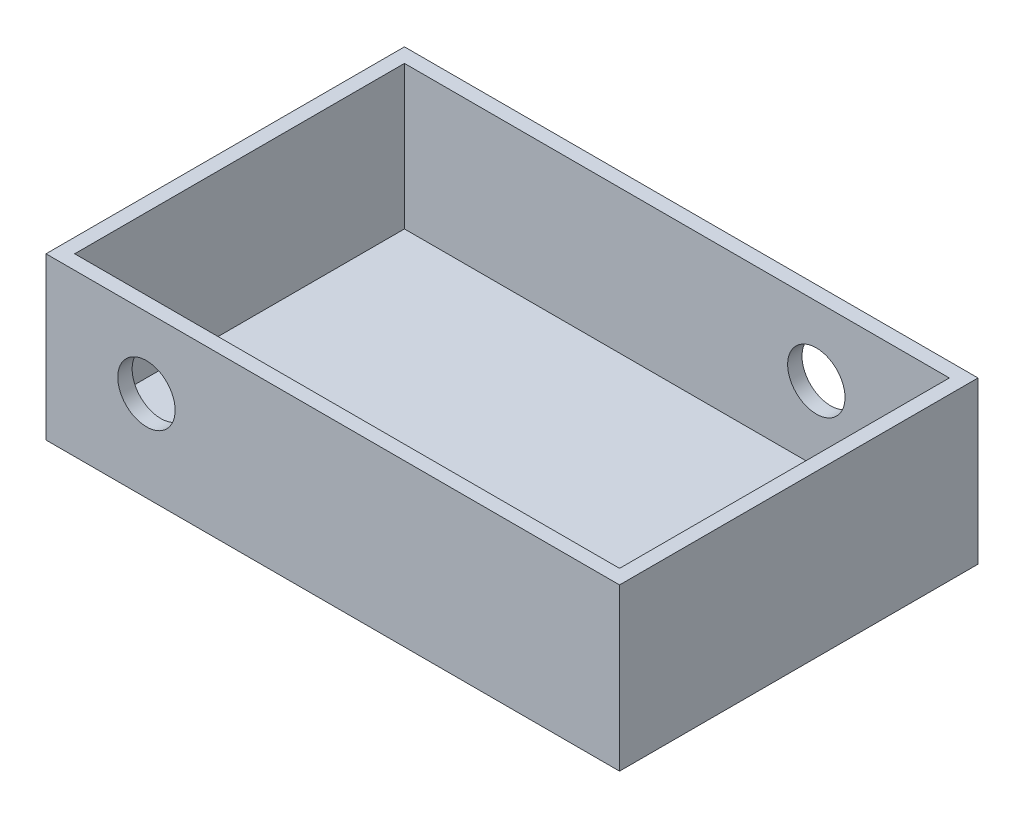
ISO-10303-21;
HEADER;
FILE_DESCRIPTION(('STEP AP214'),'2;1');
FILE_NAME('part.step','',(''),(''),'','','');
FILE_SCHEMA(('AUTOMOTIVE_DESIGN { 1 0 10303 214 1 1 1 1 }'));
ENDSEC;
DATA;
#1=APPLICATION_CONTEXT('core data for automotive mechanical design processes');
#2=APPLICATION_PROTOCOL_DEFINITION('international standard','automotive_design',2000,#1);
#3=PRODUCT_CONTEXT('',#1,'mechanical');
#4=PRODUCT('Part','Part','',(#3));
#5=PRODUCT_RELATED_PRODUCT_CATEGORY('part','',(#4));
#6=PRODUCT_DEFINITION_FORMATION('','',#4);
#7=PRODUCT_DEFINITION_CONTEXT('part definition',#1,'design');
#8=PRODUCT_DEFINITION('design','',#6,#7);
#9=PRODUCT_DEFINITION_SHAPE('','',#8);
#10=(LENGTH_UNIT() NAMED_UNIT(*) SI_UNIT(.MILLI.,.METRE.));
#11=(NAMED_UNIT(*) PLANE_ANGLE_UNIT() SI_UNIT($,.RADIAN.));
#12=(NAMED_UNIT(*) SI_UNIT($,.STERADIAN.) SOLID_ANGLE_UNIT());
#13=UNCERTAINTY_MEASURE_WITH_UNIT(LENGTH_MEASURE(1.E-05),#10,'distance_accuracy_value','');
#14=(GEOMETRIC_REPRESENTATION_CONTEXT(3) GLOBAL_UNCERTAINTY_ASSIGNED_CONTEXT((#13)) GLOBAL_UNIT_ASSIGNED_CONTEXT((#10,
#11,#12)) REPRESENTATION_CONTEXT('',''));
#15=CARTESIAN_POINT('',(0.,0.,0.));
#16=DIRECTION('',(0.,0.,1.));
#17=DIRECTION('',(1.,0.,0.));
#18=AXIS2_PLACEMENT_3D('',#15,#16,#17);
#19=CARTESIAN_POINT('',(0.,2.5,0.));
#20=DIRECTION('',(1.,0.,0.));
#21=DIRECTION('',(0.,0.,-1.));
#22=AXIS2_PLACEMENT_3D('',#19,#20,#21);
#23=PLANE('',#22);
#24=DIRECTION('',(0.,0.,1.));
#25=VECTOR('',#24,1.);
#26=CARTESIAN_POINT('',(0.,0.,0.));
#27=LINE('',#26,#25);
#28=CARTESIAN_POINT('',(0.,0.,0.));
#29=VERTEX_POINT('',#28);
#30=CARTESIAN_POINT('',(0.,0.,50.));
#31=VERTEX_POINT('',#30);
#32=EDGE_CURVE('E146',#29,#31,#27,.T.);
#33=ORIENTED_EDGE('',*,*,#32,.T.);
#34=DIRECTION('',(0.,-1.,0.));
#35=VECTOR('',#34,1.);
#36=CARTESIAN_POINT('',(0.,2.5,50.));
#37=LINE('',#36,#35);
#38=CARTESIAN_POINT('',(0.,22.5,50.));
#39=VERTEX_POINT('',#38);
#40=EDGE_CURVE('E11',#39,#31,#37,.T.);
#41=ORIENTED_EDGE('',*,*,#40,.F.);
#42=DIRECTION('',(0.,0.,1.));
#43=VECTOR('',#42,1.);
#44=CARTESIAN_POINT('',(0.,22.5,0.));
#45=LINE('',#44,#43);
#46=CARTESIAN_POINT('',(0.,22.5,0.));
#47=VERTEX_POINT('',#46);
#48=EDGE_CURVE('E112',#47,#39,#45,.T.);
#49=ORIENTED_EDGE('',*,*,#48,.F.);
#50=DIRECTION('',(0.,-1.,0.));
#51=VECTOR('',#50,1.);
#52=CARTESIAN_POINT('',(0.,2.5,0.));
#53=LINE('',#52,#51);
#54=EDGE_CURVE('E155',#47,#29,#53,.T.);
#55=ORIENTED_EDGE('',*,*,#54,.T.);
#56=EDGE_LOOP('',(#33,#41,#49,#55));
#57=FACE_BOUND('',#56,.T.);
#58=ADVANCED_FACE('F33',(#57),#23,.F.);
#59=CARTESIAN_POINT('',(0.,2.5,50.));
#60=DIRECTION('',(0.,0.,-1.));
#61=DIRECTION('',(-1.,0.,0.));
#62=AXIS2_PLACEMENT_3D('',#59,#60,#61);
#63=PLANE('',#62);
#64=CARTESIAN_POINT('',(14.0135551635012,12.6011659455116,50.));
#65=DIRECTION('',(0.,0.,1.));
#66=DIRECTION('',(1.,0.,0.));
#67=AXIS2_PLACEMENT_3D('',#64,#65,#66);
#68=CIRCLE('',#67,4.);
#69=CARTESIAN_POINT('',(18.0135551635012,12.6011659455116,50.));
#70=VERTEX_POINT('',#69);
#71=EDGE_CURVE('E227',#70,#70,#68,.T.);
#72=ORIENTED_EDGE('',*,*,#71,.F.);
#73=EDGE_LOOP('',(#72));
#74=FACE_BOUND('',#73,.T.);
#75=DIRECTION('',(1.,0.,0.));
#76=VECTOR('',#75,1.);
#77=CARTESIAN_POINT('',(0.,0.,50.));
#78=LINE('',#77,#76);
#79=CARTESIAN_POINT('',(80.,0.,50.));
#80=VERTEX_POINT('',#79);
#81=EDGE_CURVE('E149',#31,#80,#78,.T.);
#82=ORIENTED_EDGE('',*,*,#81,.T.);
#83=DIRECTION('',(0.,-1.,0.));
#84=VECTOR('',#83,1.);
#85=CARTESIAN_POINT('',(80.,2.5,50.));
#86=LINE('',#85,#84);
#87=CARTESIAN_POINT('',(80.,22.5,50.));
#88=VERTEX_POINT('',#87);
#89=EDGE_CURVE('E41',#88,#80,#86,.T.);
#90=ORIENTED_EDGE('',*,*,#89,.F.);
#91=DIRECTION('',(1.,0.,0.));
#92=VECTOR('',#91,1.);
#93=CARTESIAN_POINT('',(0.,22.5,50.));
#94=LINE('',#93,#92);
#95=EDGE_CURVE('E137',#39,#88,#94,.T.);
#96=ORIENTED_EDGE('',*,*,#95,.F.);
#97=ORIENTED_EDGE('',*,*,#40,.T.);
#98=EDGE_LOOP('',(#82,#90,#96,#97));
#99=FACE_BOUND('',#98,.T.);
#100=ADVANCED_FACE('F178',(#74,#99),#63,.F.);
#101=CARTESIAN_POINT('',(80.,2.5,0.));
#102=DIRECTION('',(-1.,0.,0.));
#103=DIRECTION('',(0.,0.,1.));
#104=AXIS2_PLACEMENT_3D('',#101,#102,#103);
#105=PLANE('',#104);
#106=DIRECTION('',(0.,0.,-1.));
#107=VECTOR('',#106,1.);
#108=CARTESIAN_POINT('',(80.,0.,0.));
#109=LINE('',#108,#107);
#110=CARTESIAN_POINT('',(80.,0.,0.));
#111=VERTEX_POINT('',#110);
#112=EDGE_CURVE('E151',#80,#111,#109,.T.);
#113=ORIENTED_EDGE('',*,*,#112,.T.);
#114=DIRECTION('',(0.,-1.,0.));
#115=VECTOR('',#114,1.);
#116=CARTESIAN_POINT('',(80.,2.5,0.));
#117=LINE('',#116,#115);
#118=CARTESIAN_POINT('',(80.,22.5,0.));
#119=VERTEX_POINT('',#118);
#120=EDGE_CURVE('E158',#119,#111,#117,.T.);
#121=ORIENTED_EDGE('',*,*,#120,.F.);
#122=DIRECTION('',(0.,0.,-1.));
#123=VECTOR('',#122,1.);
#124=CARTESIAN_POINT('',(80.,22.5,0.));
#125=LINE('',#124,#123);
#126=EDGE_CURVE('E140',#88,#119,#125,.T.);
#127=ORIENTED_EDGE('',*,*,#126,.F.);
#128=ORIENTED_EDGE('',*,*,#89,.T.);
#129=EDGE_LOOP('',(#113,#121,#127,#128));
#130=FACE_BOUND('',#129,.T.);
#131=ADVANCED_FACE('F165',(#130),#105,.F.);
#132=CARTESIAN_POINT('',(0.,2.5,0.));
#133=DIRECTION('',(0.,0.,1.));
#134=DIRECTION('',(1.,0.,0.));
#135=AXIS2_PLACEMENT_3D('',#132,#133,#134);
#136=PLANE('',#135);
#137=CARTESIAN_POINT('',(59.4490391365525,12.8599395646347,0.));
#138=DIRECTION('',(0.,0.,1.));
#139=DIRECTION('',(1.,0.,0.));
#140=AXIS2_PLACEMENT_3D('',#137,#138,#139);
#141=CIRCLE('',#140,4.00000000000001);
#142=CARTESIAN_POINT('',(63.4490391365525,12.8599395646347,0.));
#143=VERTEX_POINT('',#142);
#144=EDGE_CURVE('E226',#143,#143,#141,.T.);
#145=ORIENTED_EDGE('',*,*,#144,.T.);
#146=EDGE_LOOP('',(#145));
#147=FACE_BOUND('',#146,.T.);
#148=DIRECTION('',(-1.,0.,0.));
#149=VECTOR('',#148,1.);
#150=CARTESIAN_POINT('',(0.,0.,0.));
#151=LINE('',#150,#149);
#152=EDGE_CURVE('E153',#111,#29,#151,.T.);
#153=ORIENTED_EDGE('',*,*,#152,.T.);
#154=ORIENTED_EDGE('',*,*,#54,.F.);
#155=DIRECTION('',(-1.,0.,0.));
#156=VECTOR('',#155,1.);
#157=CARTESIAN_POINT('',(0.,22.5,0.));
#158=LINE('',#157,#156);
#159=EDGE_CURVE('E143',#119,#47,#158,.T.);
#160=ORIENTED_EDGE('',*,*,#159,.F.);
#161=ORIENTED_EDGE('',*,*,#120,.T.);
#162=EDGE_LOOP('',(#153,#154,#160,#161));
#163=FACE_BOUND('',#162,.T.);
#164=ADVANCED_FACE('F173',(#147,#163),#136,.F.);
#165=CARTESIAN_POINT('',(0.,0.,0.));
#166=DIRECTION('',(0.,1.,0.));
#167=DIRECTION('',(0.,0.,1.));
#168=AXIS2_PLACEMENT_3D('',#165,#166,#167);
#169=PLANE('',#168);
#170=ORIENTED_EDGE('',*,*,#32,.F.);
#171=ORIENTED_EDGE('',*,*,#152,.F.);
#172=ORIENTED_EDGE('',*,*,#112,.F.);
#173=ORIENTED_EDGE('',*,*,#81,.F.);
#174=EDGE_LOOP('',(#170,#171,#172,#173));
#175=FACE_BOUND('',#174,.T.);
#176=ADVANCED_FACE('F171',(#175),#169,.F.);
#177=CARTESIAN_POINT('',(0.,22.5,0.));
#178=DIRECTION('',(0.,1.,0.));
#179=DIRECTION('',(0.,0.,1.));
#180=AXIS2_PLACEMENT_3D('',#177,#178,#179);
#181=PLANE('',#180);
#182=ORIENTED_EDGE('',*,*,#48,.T.);
#183=ORIENTED_EDGE('',*,*,#95,.T.);
#184=ORIENTED_EDGE('',*,*,#126,.T.);
#185=ORIENTED_EDGE('',*,*,#159,.T.);
#186=EDGE_LOOP('',(#182,#183,#184,#185));
#187=FACE_BOUND('',#186,.T.);
#188=DIRECTION('',(0.,0.,1.));
#189=VECTOR('',#188,1.);
#190=CARTESIAN_POINT('',(2.,22.5,2.));
#191=LINE('',#190,#189);
#192=CARTESIAN_POINT('',(2.,22.5,2.));
#193=VERTEX_POINT('',#192);
#194=CARTESIAN_POINT('',(2.,22.5,48.));
#195=VERTEX_POINT('',#194);
#196=EDGE_CURVE('E106',#193,#195,#191,.T.);
#197=ORIENTED_EDGE('',*,*,#196,.F.);
#198=DIRECTION('',(-1.,0.,0.));
#199=VECTOR('',#198,1.);
#200=CARTESIAN_POINT('',(2.,22.5,2.));
#201=LINE('',#200,#199);
#202=CARTESIAN_POINT('',(78.,22.5,2.));
#203=VERTEX_POINT('',#202);
#204=EDGE_CURVE('E97',#203,#193,#201,.T.);
#205=ORIENTED_EDGE('',*,*,#204,.F.);
#206=DIRECTION('',(0.,0.,-1.));
#207=VECTOR('',#206,1.);
#208=CARTESIAN_POINT('',(78.,22.5,2.));
#209=LINE('',#208,#207);
#210=CARTESIAN_POINT('',(78.,22.5,48.));
#211=VERTEX_POINT('',#210);
#212=EDGE_CURVE('E120',#211,#203,#209,.T.);
#213=ORIENTED_EDGE('',*,*,#212,.F.);
#214=DIRECTION('',(1.,0.,0.));
#215=VECTOR('',#214,1.);
#216=CARTESIAN_POINT('',(2.,22.5,48.));
#217=LINE('',#216,#215);
#218=EDGE_CURVE('E118',#195,#211,#217,.T.);
#219=ORIENTED_EDGE('',*,*,#218,.F.);
#220=EDGE_LOOP('',(#197,#205,#213,#219));
#221=FACE_BOUND('',#220,.T.);
#222=ADVANCED_FACE('F116',(#187,#221),#181,.T.);
#223=CARTESIAN_POINT('',(2.,22.5,2.));
#224=DIRECTION('',(0.,0.,1.));
#225=DIRECTION('',(1.,0.,0.));
#226=AXIS2_PLACEMENT_3D('',#223,#224,#225);
#227=PLANE('',#226);
#228=CARTESIAN_POINT('',(59.4490391365525,12.8599395646347,2.));
#229=DIRECTION('',(0.,0.,1.));
#230=DIRECTION('',(1.,0.,0.));
#231=AXIS2_PLACEMENT_3D('',#228,#229,#230);
#232=CIRCLE('',#231,4.00000000000001);
#233=CARTESIAN_POINT('',(63.4490391365525,12.8599395646347,2.));
#234=VERTEX_POINT('',#233);
#235=EDGE_CURVE('E223',#234,#234,#232,.T.);
#236=ORIENTED_EDGE('',*,*,#235,.F.);
#237=EDGE_LOOP('',(#236));
#238=FACE_BOUND('',#237,.T.);
#239=DIRECTION('',(-1.,0.,0.));
#240=VECTOR('',#239,1.);
#241=CARTESIAN_POINT('',(2.,2.5,2.));
#242=LINE('',#241,#240);
#243=CARTESIAN_POINT('',(78.,2.5,2.));
#244=VERTEX_POINT('',#243);
#245=CARTESIAN_POINT('',(2.,2.5,2.));
#246=VERTEX_POINT('',#245);
#247=EDGE_CURVE('E48',#244,#246,#242,.T.);
#248=ORIENTED_EDGE('',*,*,#247,.F.);
#249=DIRECTION('',(0.,-1.,0.));
#250=VECTOR('',#249,1.);
#251=CARTESIAN_POINT('',(78.,22.5,2.));
#252=LINE('',#251,#250);
#253=EDGE_CURVE('E102',#203,#244,#252,.T.);
#254=ORIENTED_EDGE('',*,*,#253,.F.);
#255=ORIENTED_EDGE('',*,*,#204,.T.);
#256=DIRECTION('',(0.,-1.,0.));
#257=VECTOR('',#256,1.);
#258=CARTESIAN_POINT('',(2.,22.5,2.));
#259=LINE('',#258,#257);
#260=EDGE_CURVE('E100',#193,#246,#259,.T.);
#261=ORIENTED_EDGE('',*,*,#260,.T.);
#262=EDGE_LOOP('',(#248,#254,#255,#261));
#263=FACE_BOUND('',#262,.T.);
#264=ADVANCED_FACE('F99',(#238,#263),#227,.T.);
#265=CARTESIAN_POINT('',(2.,22.5,2.));
#266=DIRECTION('',(1.,0.,0.));
#267=DIRECTION('',(0.,0.,-1.));
#268=AXIS2_PLACEMENT_3D('',#265,#266,#267);
#269=PLANE('',#268);
#270=DIRECTION('',(0.,0.,1.));
#271=VECTOR('',#270,1.);
#272=CARTESIAN_POINT('',(2.,2.5,2.));
#273=LINE('',#272,#271);
#274=CARTESIAN_POINT('',(2.,2.5,48.));
#275=VERTEX_POINT('',#274);
#276=EDGE_CURVE('E52',#246,#275,#273,.T.);
#277=ORIENTED_EDGE('',*,*,#276,.F.);
#278=ORIENTED_EDGE('',*,*,#260,.F.);
#279=ORIENTED_EDGE('',*,*,#196,.T.);
#280=DIRECTION('',(0.,-1.,0.));
#281=VECTOR('',#280,1.);
#282=CARTESIAN_POINT('',(2.,22.5,48.));
#283=LINE('',#282,#281);
#284=EDGE_CURVE('E113',#195,#275,#283,.T.);
#285=ORIENTED_EDGE('',*,*,#284,.T.);
#286=EDGE_LOOP('',(#277,#278,#279,#285));
#287=FACE_BOUND('',#286,.T.);
#288=ADVANCED_FACE('F110',(#287),#269,.T.);
#289=CARTESIAN_POINT('',(2.,22.5,48.));
#290=DIRECTION('',(0.,0.,-1.));
#291=DIRECTION('',(-1.,0.,0.));
#292=AXIS2_PLACEMENT_3D('',#289,#290,#291);
#293=PLANE('',#292);
#294=CARTESIAN_POINT('',(14.0135551635012,12.6011659455116,48.));
#295=DIRECTION('',(0.,0.,-1.));
#296=DIRECTION('',(-1.,0.,0.));
#297=AXIS2_PLACEMENT_3D('',#294,#295,#296);
#298=CIRCLE('',#297,4.);
#299=CARTESIAN_POINT('',(10.0135551635012,12.6011659455116,48.));
#300=VERTEX_POINT('',#299);
#301=EDGE_CURVE('E36',#300,#300,#298,.T.);
#302=ORIENTED_EDGE('',*,*,#301,.F.);
#303=EDGE_LOOP('',(#302));
#304=FACE_BOUND('',#303,.T.);
#305=DIRECTION('',(1.,0.,0.));
#306=VECTOR('',#305,1.);
#307=CARTESIAN_POINT('',(2.,2.5,48.));
#308=LINE('',#307,#306);
#309=CARTESIAN_POINT('',(78.,2.5,48.));
#310=VERTEX_POINT('',#309);
#311=EDGE_CURVE('E127',#275,#310,#308,.T.);
#312=ORIENTED_EDGE('',*,*,#311,.F.);
#313=ORIENTED_EDGE('',*,*,#284,.F.);
#314=ORIENTED_EDGE('',*,*,#218,.T.);
#315=DIRECTION('',(0.,-1.,0.));
#316=VECTOR('',#315,1.);
#317=CARTESIAN_POINT('',(78.,22.5,48.));
#318=LINE('',#317,#316);
#319=EDGE_CURVE('E131',#211,#310,#318,.T.);
#320=ORIENTED_EDGE('',*,*,#319,.T.);
#321=EDGE_LOOP('',(#312,#313,#314,#320));
#322=FACE_BOUND('',#321,.T.);
#323=ADVANCED_FACE('F205',(#304,#322),#293,.T.);
#324=CARTESIAN_POINT('',(78.,22.5,2.));
#325=DIRECTION('',(-1.,0.,0.));
#326=DIRECTION('',(0.,0.,1.));
#327=AXIS2_PLACEMENT_3D('',#324,#325,#326);
#328=PLANE('',#327);
#329=DIRECTION('',(0.,0.,-1.));
#330=VECTOR('',#329,1.);
#331=CARTESIAN_POINT('',(78.,2.5,2.));
#332=LINE('',#331,#330);
#333=EDGE_CURVE('E107',#310,#244,#332,.T.);
#334=ORIENTED_EDGE('',*,*,#333,.F.);
#335=ORIENTED_EDGE('',*,*,#319,.F.);
#336=ORIENTED_EDGE('',*,*,#212,.T.);
#337=ORIENTED_EDGE('',*,*,#253,.T.);
#338=EDGE_LOOP('',(#334,#335,#336,#337));
#339=FACE_BOUND('',#338,.T.);
#340=ADVANCED_FACE('F197',(#339),#328,.T.);
#341=CARTESIAN_POINT('',(0.,2.5,0.));
#342=DIRECTION('',(0.,1.,0.));
#343=DIRECTION('',(0.,0.,1.));
#344=AXIS2_PLACEMENT_3D('',#341,#342,#343);
#345=PLANE('',#344);
#346=ORIENTED_EDGE('',*,*,#247,.T.);
#347=ORIENTED_EDGE('',*,*,#276,.T.);
#348=ORIENTED_EDGE('',*,*,#311,.T.);
#349=ORIENTED_EDGE('',*,*,#333,.T.);
#350=EDGE_LOOP('',(#346,#347,#348,#349));
#351=FACE_BOUND('',#350,.T.);
#352=ADVANCED_FACE('F193',(#351),#345,.T.);
#353=CARTESIAN_POINT('',(14.0135551635012,12.6011659455116,30.));
#354=DIRECTION('',(0.,0.,1.));
#355=DIRECTION('',(1.,0.,0.));
#356=AXIS2_PLACEMENT_3D('',#353,#354,#355);
#357=CYLINDRICAL_SURFACE('',#356,4.);
#358=ORIENTED_EDGE('',*,*,#301,.T.);
#359=EDGE_LOOP('',(#358));
#360=FACE_BOUND('',#359,.T.);
#361=ORIENTED_EDGE('',*,*,#71,.T.);
#362=EDGE_LOOP('',(#361));
#363=FACE_BOUND('',#362,.T.);
#364=ADVANCED_FACE('F196',(#360,#363),#357,.F.);
#365=CARTESIAN_POINT('',(59.4490391365525,12.8599395646347,-18.));
#366=DIRECTION('',(0.,0.,1.));
#367=DIRECTION('',(1.,0.,0.));
#368=AXIS2_PLACEMENT_3D('',#365,#366,#367);
#369=CYLINDRICAL_SURFACE('',#368,4.00000000000001);
#370=ORIENTED_EDGE('',*,*,#235,.T.);
#371=EDGE_LOOP('',(#370));
#372=FACE_BOUND('',#371,.T.);
#373=ORIENTED_EDGE('',*,*,#144,.F.);
#374=EDGE_LOOP('',(#373));
#375=FACE_BOUND('',#374,.T.);
#376=ADVANCED_FACE('F214',(#372,#375),#369,.F.);
#377=CLOSED_SHELL('',(#58,#100,#131,#164,#176,#222,#264,#288,#323,#340,#352,#364,#376));
#378=MANIFOLD_SOLID_BREP('B2',#377);
#379=ADVANCED_BREP_SHAPE_REPRESENTATION('',(#18,#378),#14);
#380=SHAPE_DEFINITION_REPRESENTATION(#9,#379);
ENDSEC;
END-ISO-10303-21;
